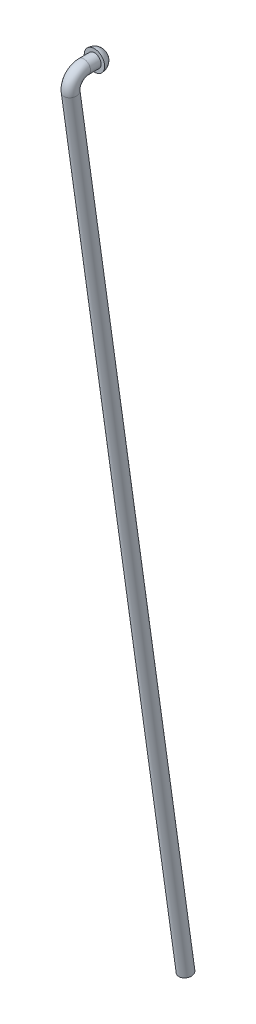
ISO-10303-21;
HEADER;
FILE_DESCRIPTION(('STEP AP214'),'2;1');
FILE_NAME('part.step','',(''),(''),'','','');
FILE_SCHEMA(('AUTOMOTIVE_DESIGN { 1 0 10303 214 1 1 1 1 }'));
ENDSEC;
DATA;
#1=APPLICATION_CONTEXT('core data for automotive mechanical design processes');
#2=APPLICATION_PROTOCOL_DEFINITION('international standard','automotive_design',2000,#1);
#3=PRODUCT_CONTEXT('',#1,'mechanical');
#4=PRODUCT('Part','Part','',(#3));
#5=PRODUCT_RELATED_PRODUCT_CATEGORY('part','',(#4));
#6=PRODUCT_DEFINITION_FORMATION('','',#4);
#7=PRODUCT_DEFINITION_CONTEXT('part definition',#1,'design');
#8=PRODUCT_DEFINITION('design','',#6,#7);
#9=PRODUCT_DEFINITION_SHAPE('','',#8);
#10=(LENGTH_UNIT() NAMED_UNIT(*) SI_UNIT(.MILLI.,.METRE.));
#11=(NAMED_UNIT(*) PLANE_ANGLE_UNIT() SI_UNIT($,.RADIAN.));
#12=(NAMED_UNIT(*) SI_UNIT($,.STERADIAN.) SOLID_ANGLE_UNIT());
#13=UNCERTAINTY_MEASURE_WITH_UNIT(LENGTH_MEASURE(1.E-05),#10,'distance_accuracy_value','');
#14=(GEOMETRIC_REPRESENTATION_CONTEXT(3) GLOBAL_UNCERTAINTY_ASSIGNED_CONTEXT((#13)) GLOBAL_UNIT_ASSIGNED_CONTEXT((#10,
#11,#12)) REPRESENTATION_CONTEXT('',''));
#15=CARTESIAN_POINT('',(0.,0.,0.));
#16=DIRECTION('',(0.,0.,1.));
#17=DIRECTION('',(1.,0.,0.));
#18=AXIS2_PLACEMENT_3D('',#15,#16,#17);
#19=CARTESIAN_POINT('',(0.,38.968534378227,-0.47893919699514));
#20=DIRECTION('',(0.,-0.990316588986842,-0.138827423722641));
#21=DIRECTION('',(0.,0.138827423722641,-0.990316588986842));
#22=AXIS2_PLACEMENT_3D('',#19,#20,#21);
#23=CYLINDRICAL_SURFACE('',#22,1.5);
#24=CARTESIAN_POINT('',(0.,38.968534378227,-0.47893919699514));
#25=DIRECTION('',(0.,-0.99031658898684,-0.13882742372266));
#26=DIRECTION('',(1.,0.,0.));
#27=AXIS2_PLACEMENT_3D('',#24,#25,#26);
#28=CIRCLE('',#27,1.5);
#29=CARTESIAN_POINT('',(0.,38.760293242643,1.00653568648512));
#30=VERTEX_POINT('',#29);
#31=EDGE_CURVE('E38',#30,#30,#28,.T.);
#32=ORIENTED_EDGE('',*,*,#31,.T.);
#33=EDGE_LOOP('',(#32));
#34=FACE_BOUND('',#33,.T.);
#35=CARTESIAN_POINT('',(0.,-145.577071940308,-26.3494450225573));
#36=DIRECTION('',(0.,-0.99031658898684,-0.13882742372266));
#37=DIRECTION('',(1.,0.,0.));
#38=AXIS2_PLACEMENT_3D('',#35,#36,#37);
#39=CIRCLE('',#38,1.5);
#40=CARTESIAN_POINT('',(1.5,-145.577071940308,-26.3494450225573));
#41=VERTEX_POINT('',#40);
#42=EDGE_CURVE('E10',#41,#41,#39,.T.);
#43=ORIENTED_EDGE('',*,*,#42,.F.);
#44=EDGE_LOOP('',(#43));
#45=FACE_BOUND('',#44,.T.);
#46=ADVANCED_FACE('F32',(#34,#45),#23,.T.);
#47=CARTESIAN_POINT('',(0.,39.3850166493949,-3.44988896395566));
#48=DIRECTION('',(1.,0.,0.));
#49=DIRECTION('',(0.,0.,-1.));
#50=AXIS2_PLACEMENT_3D('',#47,#48,#49);
#51=TOROIDAL_SURFACE('',#50,3.,1.5);
#52=CARTESIAN_POINT('',(0.,42.3850166493949,-3.44988896395569));
#53=DIRECTION('',(0.,0.,1.));
#54=DIRECTION('',(1.,0.,0.));
#55=AXIS2_PLACEMENT_3D('',#52,#53,#54);
#56=CIRCLE('',#55,1.5);
#57=CARTESIAN_POINT('',(0.,43.885016649395,-3.44988896395571));
#58=VERTEX_POINT('',#57);
#59=EDGE_CURVE('E42',#58,#58,#56,.T.);
#60=CARTESIAN_POINT('',(0.,39.3850166493949,-3.44988896395566));
#61=DIRECTION('',(1.,0.,0.));
#62=DIRECTION('',(0.,0.,-1.));
#63=AXIS2_PLACEMENT_3D('',#60,#61,#62);
#64=CIRCLE('',#63,4.5);
#65=EDGE_CURVE('',#58,#30,#64,.T.);
#66=ORIENTED_EDGE('',*,*,#59,.T.);
#67=ORIENTED_EDGE('',*,*,#31,.F.);
#68=ORIENTED_EDGE('',*,*,#65,.T.);
#69=ORIENTED_EDGE('',*,*,#65,.F.);
#70=EDGE_LOOP('',(#66,#68,#67,#69));
#71=FACE_BOUND('',#70,.T.);
#72=ADVANCED_FACE('F66',(#71),#51,.T.);
#73=CARTESIAN_POINT('',(0.,42.3850166493949,-3.44988896395569));
#74=DIRECTION('',(0.,0.,-1.));
#75=DIRECTION('',(-1.,0.,0.));
#76=AXIS2_PLACEMENT_3D('',#73,#74,#75);
#77=CYLINDRICAL_SURFACE('',#76,1.5);
#78=ORIENTED_EDGE('',*,*,#59,.F.);
#79=EDGE_LOOP('',(#78));
#80=FACE_BOUND('',#79,.T.);
#81=CARTESIAN_POINT('',(0.,42.3850166493949,-5.84));
#82=DIRECTION('',(0.,0.,1.));
#83=DIRECTION('',(1.,0.,0.));
#84=AXIS2_PLACEMENT_3D('',#81,#82,#83);
#85=CIRCLE('',#84,1.5);
#86=CARTESIAN_POINT('',(1.5,42.3850166493949,-5.84));
#87=VERTEX_POINT('',#86);
#88=EDGE_CURVE('E46',#87,#87,#85,.T.);
#89=ORIENTED_EDGE('',*,*,#88,.T.);
#90=EDGE_LOOP('',(#89));
#91=FACE_BOUND('',#90,.T.);
#92=ADVANCED_FACE('F64',(#80,#91),#77,.T.);
#93=CARTESIAN_POINT('',(0.,-145.577071940308,-26.3494450225573));
#94=DIRECTION('',(0.,-0.99031658898684,-0.13882742372266));
#95=DIRECTION('',(1.,0.,0.));
#96=AXIS2_PLACEMENT_3D('',#93,#94,#95);
#97=PLANE('',#96);
#98=ORIENTED_EDGE('',*,*,#42,.T.);
#99=EDGE_LOOP('',(#98));
#100=FACE_BOUND('',#99,.T.);
#101=ADVANCED_FACE('F60',(#100),#97,.T.);
#102=CARTESIAN_POINT('',(0.,42.3850166493949,-5.84));
#103=DIRECTION('',(0.,0.,1.));
#104=DIRECTION('',(1.,0.,0.));
#105=AXIS2_PLACEMENT_3D('',#102,#103,#104);
#106=PLANE('',#105);
#107=CARTESIAN_POINT('',(0.,42.3850166493949,-5.84));
#108=DIRECTION('',(0.,0.,-1.));
#109=DIRECTION('',(-1.,0.,0.));
#110=AXIS2_PLACEMENT_3D('',#107,#108,#109);
#111=CIRCLE('',#110,2.3);
#112=CARTESIAN_POINT('',(-2.3,42.3850166493949,-5.84));
#113=VERTEX_POINT('',#112);
#114=EDGE_CURVE('E51',#113,#113,#111,.T.);
#115=ORIENTED_EDGE('',*,*,#114,.F.);
#116=EDGE_LOOP('',(#115));
#117=FACE_BOUND('',#116,.T.);
#118=ORIENTED_EDGE('',*,*,#88,.F.);
#119=EDGE_LOOP('',(#118));
#120=FACE_BOUND('',#119,.T.);
#121=ADVANCED_FACE('F57',(#117,#120),#106,.T.);
#122=CARTESIAN_POINT('',(0.,42.3850166493949,-5.84));
#123=DIRECTION('',(0.,0.,-1.));
#124=DIRECTION('',(0.,-1.,0.));
#125=AXIS2_PLACEMENT_3D('',#122,#123,#124);
#126=SPHERICAL_SURFACE('',#125,2.3);
#127=ORIENTED_EDGE('',*,*,#114,.T.);
#128=EDGE_LOOP('',(#127));
#129=FACE_BOUND('',#128,.T.);
#130=ADVANCED_FACE('F55',(#129),#126,.T.);
#131=CLOSED_SHELL('',(#46,#72,#92,#101,#121,#130));
#132=MANIFOLD_SOLID_BREP('B2',#131);
#133=ADVANCED_BREP_SHAPE_REPRESENTATION('',(#18,#132),#14);
#134=SHAPE_DEFINITION_REPRESENTATION(#9,#133);
ENDSEC;
END-ISO-10303-21;
